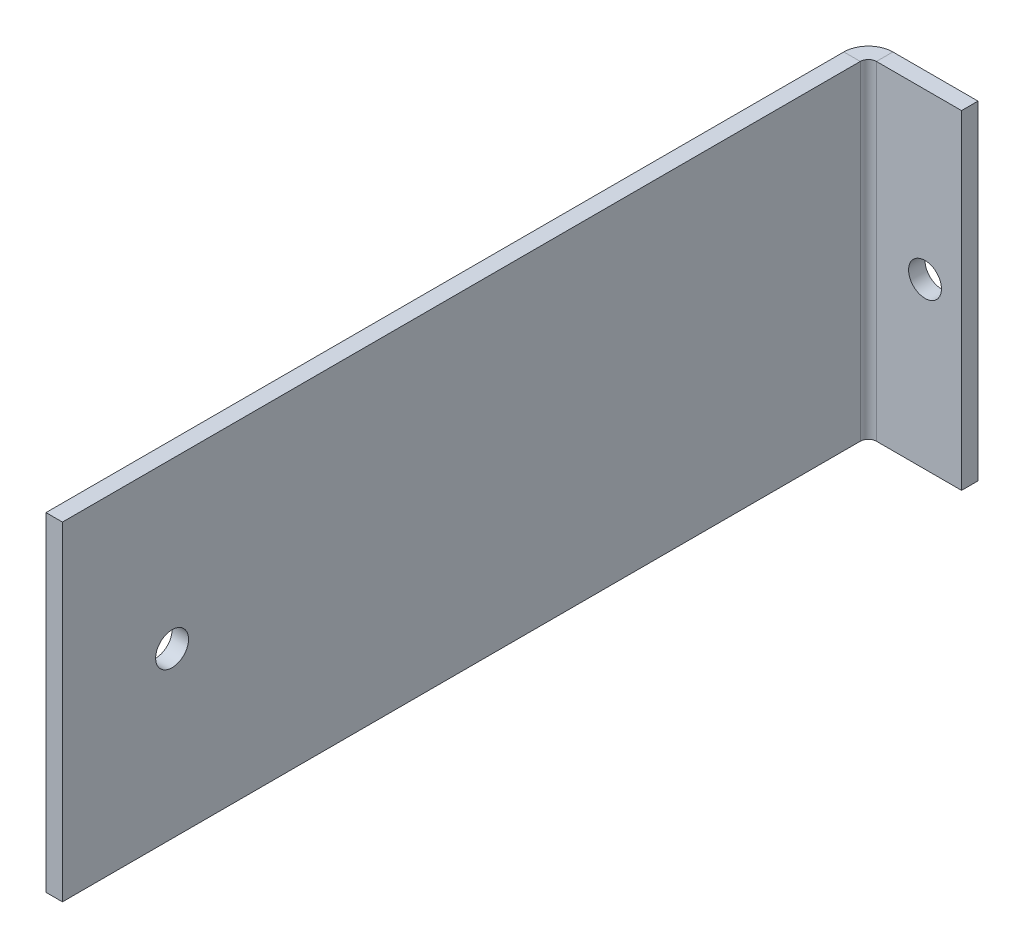
ISO-10303-21;
HEADER;
FILE_DESCRIPTION(('STEP AP214'),'2;1');
FILE_NAME('part.step','',(''),(''),'','','');
FILE_SCHEMA(('AUTOMOTIVE_DESIGN { 1 0 10303 214 1 1 1 1 }'));
ENDSEC;
DATA;
#1=APPLICATION_CONTEXT('core data for automotive mechanical design processes');
#2=APPLICATION_PROTOCOL_DEFINITION('international standard','automotive_design',2000,#1);
#3=PRODUCT_CONTEXT('',#1,'mechanical');
#4=PRODUCT('Part','Part','',(#3));
#5=PRODUCT_RELATED_PRODUCT_CATEGORY('part','',(#4));
#6=PRODUCT_DEFINITION_FORMATION('','',#4);
#7=PRODUCT_DEFINITION_CONTEXT('part definition',#1,'design');
#8=PRODUCT_DEFINITION('design','',#6,#7);
#9=PRODUCT_DEFINITION_SHAPE('','',#8);
#10=(LENGTH_UNIT() NAMED_UNIT(*) SI_UNIT(.MILLI.,.METRE.));
#11=(NAMED_UNIT(*) PLANE_ANGLE_UNIT() SI_UNIT($,.RADIAN.));
#12=(NAMED_UNIT(*) SI_UNIT($,.STERADIAN.) SOLID_ANGLE_UNIT());
#13=UNCERTAINTY_MEASURE_WITH_UNIT(LENGTH_MEASURE(1.E-05),#10,'distance_accuracy_value','');
#14=(GEOMETRIC_REPRESENTATION_CONTEXT(3) GLOBAL_UNCERTAINTY_ASSIGNED_CONTEXT((#13)) GLOBAL_UNIT_ASSIGNED_CONTEXT((#10,
#11,#12)) REPRESENTATION_CONTEXT('',''));
#15=CARTESIAN_POINT('',(0.,0.,0.));
#16=DIRECTION('',(0.,0.,1.));
#17=DIRECTION('',(1.,0.,0.));
#18=AXIS2_PLACEMENT_3D('',#15,#16,#17);
#19=CARTESIAN_POINT('',(2.2366,30.,-75.));
#20=DIRECTION('',(0.,1.,0.));
#21=DIRECTION('',(0.,0.,1.));
#22=AXIS2_PLACEMENT_3D('',#19,#20,#21);
#23=PLANE('',#22);
#24=DIRECTION('',(0.,0.,1.));
#25=VECTOR('',#24,1.);
#26=CARTESIAN_POINT('',(2.2366,30.,-75.));
#27=LINE('',#26,#25);
#28=CARTESIAN_POINT('',(2.2366,30.,-75.));
#29=VERTEX_POINT('',#28);
#30=CARTESIAN_POINT('',(2.2366,30.,-73.5));
#31=VERTEX_POINT('',#30);
#32=EDGE_CURVE('E11',#29,#31,#27,.T.);
#33=ORIENTED_EDGE('',*,*,#32,.F.);
#34=CARTESIAN_POINT('',(2.2366,30.,-72.7634));
#35=DIRECTION('',(0.,1.,0.));
#36=DIRECTION('',(0.,0.,1.));
#37=AXIS2_PLACEMENT_3D('',#34,#35,#36);
#38=CIRCLE('',#37,2.2366);
#39=CARTESIAN_POINT('',(0.,30.,-72.7634));
#40=VERTEX_POINT('',#39);
#41=EDGE_CURVE('E134',#40,#29,#38,.F.);
#42=ORIENTED_EDGE('',*,*,#41,.F.);
#43=DIRECTION('',(-1.,0.,0.));
#44=VECTOR('',#43,1.);
#45=CARTESIAN_POINT('',(1.5,30.,-72.7634));
#46=LINE('',#45,#44);
#47=CARTESIAN_POINT('',(1.5,30.,-72.7634));
#48=VERTEX_POINT('',#47);
#49=EDGE_CURVE('E45',#48,#40,#46,.T.);
#50=ORIENTED_EDGE('',*,*,#49,.F.);
#51=CARTESIAN_POINT('',(2.2366,30.,-72.7634));
#52=DIRECTION('',(0.,1.,0.));
#53=DIRECTION('',(1.,0.,0.));
#54=AXIS2_PLACEMENT_3D('',#51,#52,#53);
#55=CIRCLE('',#54,0.7366);
#56=EDGE_CURVE('E127',#48,#31,#55,.F.);
#57=ORIENTED_EDGE('',*,*,#56,.T.);
#58=EDGE_LOOP('',(#33,#42,#50,#57));
#59=FACE_BOUND('',#58,.T.);
#60=ADVANCED_FACE('F37',(#59),#23,.T.);
#61=CARTESIAN_POINT('',(1.5,30.,-72.7634));
#62=DIRECTION('',(0.,1.,0.));
#63=DIRECTION('',(0.,0.,1.));
#64=AXIS2_PLACEMENT_3D('',#61,#62,#63);
#65=PLANE('',#64);
#66=DIRECTION('',(1.,0.,0.));
#67=VECTOR('',#66,1.);
#68=CARTESIAN_POINT('',(0.,30.,-75.));
#69=LINE('',#68,#67);
#70=CARTESIAN_POINT('',(10.,30.,-75.));
#71=VERTEX_POINT('',#70);
#72=EDGE_CURVE('E184',#29,#71,#69,.T.);
#73=ORIENTED_EDGE('',*,*,#72,.F.);
#74=ORIENTED_EDGE('',*,*,#32,.T.);
#75=DIRECTION('',(1.,0.,0.));
#76=VECTOR('',#75,1.);
#77=CARTESIAN_POINT('',(0.,30.,-73.5));
#78=LINE('',#77,#76);
#79=CARTESIAN_POINT('',(10.,30.,-73.5));
#80=VERTEX_POINT('',#79);
#81=EDGE_CURVE('E93',#31,#80,#78,.T.);
#82=ORIENTED_EDGE('',*,*,#81,.T.);
#83=DIRECTION('',(0.,0.,1.));
#84=VECTOR('',#83,1.);
#85=CARTESIAN_POINT('',(10.,30.,-75.));
#86=LINE('',#85,#84);
#87=EDGE_CURVE('E359',#71,#80,#86,.T.);
#88=ORIENTED_EDGE('',*,*,#87,.F.);
#89=EDGE_LOOP('',(#73,#74,#82,#88));
#90=FACE_BOUND('',#89,.T.);
#91=ADVANCED_FACE('F192',(#90),#65,.T.);
#92=CARTESIAN_POINT('',(0.,0.,-72.7634));
#93=DIRECTION('',(0.,-1.,0.));
#94=DIRECTION('',(0.,0.,-1.));
#95=AXIS2_PLACEMENT_3D('',#92,#93,#94);
#96=PLANE('',#95);
#97=DIRECTION('',(1.,0.,0.));
#98=VECTOR('',#97,1.);
#99=CARTESIAN_POINT('',(0.,0.,-72.7634));
#100=LINE('',#99,#98);
#101=CARTESIAN_POINT('',(0.,0.,-72.7634));
#102=VERTEX_POINT('',#101);
#103=CARTESIAN_POINT('',(1.5,0.,-72.7634));
#104=VERTEX_POINT('',#103);
#105=EDGE_CURVE('E80',#102,#104,#100,.T.);
#106=ORIENTED_EDGE('',*,*,#105,.F.);
#107=CARTESIAN_POINT('',(2.2366,0.,-72.7634));
#108=DIRECTION('',(0.,1.,0.));
#109=DIRECTION('',(0.,0.,1.));
#110=AXIS2_PLACEMENT_3D('',#107,#108,#109);
#111=CIRCLE('',#110,2.2366);
#112=CARTESIAN_POINT('',(2.2366,0.,-75.));
#113=VERTEX_POINT('',#112);
#114=EDGE_CURVE('E150',#102,#113,#111,.F.);
#115=ORIENTED_EDGE('',*,*,#114,.T.);
#116=DIRECTION('',(0.,0.,-1.));
#117=VECTOR('',#116,1.);
#118=CARTESIAN_POINT('',(2.2366,0.,-73.5));
#119=LINE('',#118,#117);
#120=CARTESIAN_POINT('',(2.2366,0.,-73.5));
#121=VERTEX_POINT('',#120);
#122=EDGE_CURVE('E87',#121,#113,#119,.T.);
#123=ORIENTED_EDGE('',*,*,#122,.F.);
#124=CARTESIAN_POINT('',(2.2366,0.,-72.7634));
#125=DIRECTION('',(0.,1.,0.));
#126=DIRECTION('',(1.,0.,0.));
#127=AXIS2_PLACEMENT_3D('',#124,#125,#126);
#128=CIRCLE('',#127,0.7366);
#129=EDGE_CURVE('E157',#104,#121,#128,.F.);
#130=ORIENTED_EDGE('',*,*,#129,.F.);
#131=EDGE_LOOP('',(#106,#115,#123,#130));
#132=FACE_BOUND('',#131,.T.);
#133=ADVANCED_FACE('F190',(#132),#96,.T.);
#134=CARTESIAN_POINT('',(2.2366,0.,-73.5));
#135=DIRECTION('',(0.,-1.,0.));
#136=DIRECTION('',(0.,0.,-1.));
#137=AXIS2_PLACEMENT_3D('',#134,#135,#136);
#138=PLANE('',#137);
#139=DIRECTION('',(0.,0.,-1.));
#140=VECTOR('',#139,1.);
#141=CARTESIAN_POINT('',(0.,0.,0.));
#142=LINE('',#141,#140);
#143=CARTESIAN_POINT('',(0.,0.,0.));
#144=VERTEX_POINT('',#143);
#145=EDGE_CURVE('E152',#144,#102,#142,.T.);
#146=ORIENTED_EDGE('',*,*,#145,.T.);
#147=ORIENTED_EDGE('',*,*,#105,.T.);
#148=DIRECTION('',(0.,0.,-1.));
#149=VECTOR('',#148,1.);
#150=CARTESIAN_POINT('',(1.5,0.,0.));
#151=LINE('',#150,#149);
#152=CARTESIAN_POINT('',(1.5,0.,0.));
#153=VERTEX_POINT('',#152);
#154=EDGE_CURVE('E155',#153,#104,#151,.T.);
#155=ORIENTED_EDGE('',*,*,#154,.F.);
#156=DIRECTION('',(-1.,0.,0.));
#157=VECTOR('',#156,1.);
#158=CARTESIAN_POINT('',(1.5,0.,0.));
#159=LINE('',#158,#157);
#160=EDGE_CURVE('E115',#153,#144,#159,.T.);
#161=ORIENTED_EDGE('',*,*,#160,.T.);
#162=EDGE_LOOP('',(#146,#147,#155,#161));
#163=FACE_BOUND('',#162,.T.);
#164=ADVANCED_FACE('F186',(#163),#138,.T.);
#165=CARTESIAN_POINT('',(0.,30.,-73.5));
#166=DIRECTION('',(0.,0.,-1.));
#167=DIRECTION('',(-1.,0.,0.));
#168=AXIS2_PLACEMENT_3D('',#165,#166,#167);
#169=PLANE('',#168);
#170=CARTESIAN_POINT('',(6.66718668708199,15.,-73.5));
#171=DIRECTION('',(0.,0.,-1.));
#172=DIRECTION('',(-1.,0.,0.));
#173=AXIS2_PLACEMENT_3D('',#170,#171,#172);
#174=CIRCLE('',#173,1.49999999999999);
#175=CARTESIAN_POINT('',(5.167186687082,15.,-73.5));
#176=VERTEX_POINT('',#175);
#177=EDGE_CURVE('E144',#176,#176,#174,.T.);
#178=ORIENTED_EDGE('',*,*,#177,.T.);
#179=EDGE_LOOP('',(#178));
#180=FACE_BOUND('',#179,.T.);
#181=DIRECTION('',(1.,0.,0.));
#182=VECTOR('',#181,1.);
#183=CARTESIAN_POINT('',(0.,0.,-73.5));
#184=LINE('',#183,#182);
#185=CARTESIAN_POINT('',(10.,0.,-73.5));
#186=VERTEX_POINT('',#185);
#187=EDGE_CURVE('E140',#121,#186,#184,.T.);
#188=ORIENTED_EDGE('',*,*,#187,.T.);
#189=DIRECTION('',(0.,-1.,0.));
#190=VECTOR('',#189,1.);
#191=CARTESIAN_POINT('',(10.,30.,-73.5));
#192=LINE('',#191,#190);
#193=EDGE_CURVE('E171',#80,#186,#192,.T.);
#194=ORIENTED_EDGE('',*,*,#193,.F.);
#195=ORIENTED_EDGE('',*,*,#81,.F.);
#196=DIRECTION('',(0.,-1.,0.));
#197=VECTOR('',#196,1.);
#198=CARTESIAN_POINT('',(2.2366,30.,-73.5));
#199=LINE('',#198,#197);
#200=EDGE_CURVE('E139',#31,#121,#199,.T.);
#201=ORIENTED_EDGE('',*,*,#200,.T.);
#202=EDGE_LOOP('',(#188,#194,#195,#201));
#203=FACE_BOUND('',#202,.T.);
#204=ADVANCED_FACE('F198',(#180,#203),#169,.F.);
#205=CARTESIAN_POINT('',(10.,30.,-75.));
#206=DIRECTION('',(1.,0.,0.));
#207=DIRECTION('',(0.,0.,-1.));
#208=AXIS2_PLACEMENT_3D('',#205,#206,#207);
#209=PLANE('',#208);
#210=DIRECTION('',(0.,0.,1.));
#211=VECTOR('',#210,1.);
#212=CARTESIAN_POINT('',(10.,0.,-75.));
#213=LINE('',#212,#211);
#214=CARTESIAN_POINT('',(10.,0.,-75.));
#215=VERTEX_POINT('',#214);
#216=EDGE_CURVE('E143',#215,#186,#213,.T.);
#217=ORIENTED_EDGE('',*,*,#216,.F.);
#218=DIRECTION('',(0.,-1.,0.));
#219=VECTOR('',#218,1.);
#220=CARTESIAN_POINT('',(10.,30.,-75.));
#221=LINE('',#220,#219);
#222=EDGE_CURVE('E169',#71,#215,#221,.T.);
#223=ORIENTED_EDGE('',*,*,#222,.F.);
#224=ORIENTED_EDGE('',*,*,#87,.T.);
#225=ORIENTED_EDGE('',*,*,#193,.T.);
#226=EDGE_LOOP('',(#217,#223,#224,#225));
#227=FACE_BOUND('',#226,.T.);
#228=ADVANCED_FACE('F227',(#227),#209,.T.);
#229=CARTESIAN_POINT('',(0.,30.,-75.));
#230=DIRECTION('',(0.,0.,-1.));
#231=DIRECTION('',(-1.,0.,0.));
#232=AXIS2_PLACEMENT_3D('',#229,#230,#231);
#233=PLANE('',#232);
#234=CARTESIAN_POINT('',(6.66718668708199,15.,-75.));
#235=DIRECTION('',(0.,0.,-1.));
#236=DIRECTION('',(-1.,0.,0.));
#237=AXIS2_PLACEMENT_3D('',#234,#235,#236);
#238=CIRCLE('',#237,1.49999999999999);
#239=CARTESIAN_POINT('',(5.16718668708201,15.,-75.));
#240=VERTEX_POINT('',#239);
#241=EDGE_CURVE('E351',#240,#240,#238,.T.);
#242=ORIENTED_EDGE('',*,*,#241,.F.);
#243=EDGE_LOOP('',(#242));
#244=FACE_BOUND('',#243,.T.);
#245=DIRECTION('',(1.,0.,0.));
#246=VECTOR('',#245,1.);
#247=CARTESIAN_POINT('',(0.,0.,-75.));
#248=LINE('',#247,#246);
#249=EDGE_CURVE('E147',#113,#215,#248,.T.);
#250=ORIENTED_EDGE('',*,*,#249,.F.);
#251=DIRECTION('',(0.,-1.,0.));
#252=VECTOR('',#251,1.);
#253=CARTESIAN_POINT('',(2.2366,30.,-75.));
#254=LINE('',#253,#252);
#255=EDGE_CURVE('E166',#29,#113,#254,.T.);
#256=ORIENTED_EDGE('',*,*,#255,.F.);
#257=ORIENTED_EDGE('',*,*,#72,.T.);
#258=ORIENTED_EDGE('',*,*,#222,.T.);
#259=EDGE_LOOP('',(#250,#256,#257,#258));
#260=FACE_BOUND('',#259,.T.);
#261=ADVANCED_FACE('F232',(#244,#260),#233,.T.);
#262=CARTESIAN_POINT('',(2.2366,30.,-72.7634));
#263=DIRECTION('',(0.,-1.,0.));
#264=DIRECTION('',(0.,0.,-1.));
#265=AXIS2_PLACEMENT_3D('',#262,#263,#264);
#266=CYLINDRICAL_SURFACE('',#265,2.2366);
#267=ORIENTED_EDGE('',*,*,#114,.F.);
#268=DIRECTION('',(0.,-1.,0.));
#269=VECTOR('',#268,1.);
#270=CARTESIAN_POINT('',(0.,30.,-72.7634));
#271=LINE('',#270,#269);
#272=EDGE_CURVE('E163',#40,#102,#271,.T.);
#273=ORIENTED_EDGE('',*,*,#272,.F.);
#274=ORIENTED_EDGE('',*,*,#41,.T.);
#275=ORIENTED_EDGE('',*,*,#255,.T.);
#276=EDGE_LOOP('',(#267,#273,#274,#275));
#277=FACE_BOUND('',#276,.T.);
#278=ADVANCED_FACE('F180',(#277),#266,.T.);
#279=CARTESIAN_POINT('',(0.,30.,0.));
#280=DIRECTION('',(-1.,0.,0.));
#281=DIRECTION('',(0.,0.,1.));
#282=AXIS2_PLACEMENT_3D('',#279,#280,#281);
#283=PLANE('',#282);
#284=CARTESIAN_POINT('',(0.,15.,-10.));
#285=DIRECTION('',(-1.,0.,0.));
#286=DIRECTION('',(0.,0.,1.));
#287=AXIS2_PLACEMENT_3D('',#284,#285,#286);
#288=CIRCLE('',#287,1.49999999999999);
#289=CARTESIAN_POINT('',(0.,15.,-8.50000000000001));
#290=VERTEX_POINT('',#289);
#291=EDGE_CURVE('E349',#290,#290,#288,.T.);
#292=ORIENTED_EDGE('',*,*,#291,.F.);
#293=EDGE_LOOP('',(#292));
#294=FACE_BOUND('',#293,.T.);
#295=ORIENTED_EDGE('',*,*,#145,.F.);
#296=DIRECTION('',(0.,-1.,0.));
#297=VECTOR('',#296,1.);
#298=CARTESIAN_POINT('',(0.,30.,0.));
#299=LINE('',#298,#297);
#300=CARTESIAN_POINT('',(0.,30.,0.));
#301=VERTEX_POINT('',#300);
#302=EDGE_CURVE('E117',#301,#144,#299,.T.);
#303=ORIENTED_EDGE('',*,*,#302,.F.);
#304=DIRECTION('',(0.,0.,-1.));
#305=VECTOR('',#304,1.);
#306=CARTESIAN_POINT('',(0.,30.,0.));
#307=LINE('',#306,#305);
#308=EDGE_CURVE('E132',#301,#40,#307,.T.);
#309=ORIENTED_EDGE('',*,*,#308,.T.);
#310=ORIENTED_EDGE('',*,*,#272,.T.);
#311=EDGE_LOOP('',(#295,#303,#309,#310));
#312=FACE_BOUND('',#311,.T.);
#313=ADVANCED_FACE('F185',(#294,#312),#283,.T.);
#314=CARTESIAN_POINT('',(1.5,30.,0.));
#315=DIRECTION('',(0.,0.,1.));
#316=DIRECTION('',(1.,0.,0.));
#317=AXIS2_PLACEMENT_3D('',#314,#315,#316);
#318=PLANE('',#317);
#319=ORIENTED_EDGE('',*,*,#160,.F.);
#320=DIRECTION('',(0.,-1.,0.));
#321=VECTOR('',#320,1.);
#322=CARTESIAN_POINT('',(1.5,30.,0.));
#323=LINE('',#322,#321);
#324=CARTESIAN_POINT('',(1.5,30.,0.));
#325=VERTEX_POINT('',#324);
#326=EDGE_CURVE('E109',#325,#153,#323,.T.);
#327=ORIENTED_EDGE('',*,*,#326,.F.);
#328=DIRECTION('',(-1.,0.,0.));
#329=VECTOR('',#328,1.);
#330=CARTESIAN_POINT('',(1.5,30.,0.));
#331=LINE('',#330,#329);
#332=EDGE_CURVE('E113',#325,#301,#331,.T.);
#333=ORIENTED_EDGE('',*,*,#332,.T.);
#334=ORIENTED_EDGE('',*,*,#302,.T.);
#335=EDGE_LOOP('',(#319,#327,#333,#334));
#336=FACE_BOUND('',#335,.T.);
#337=ADVANCED_FACE('F111',(#336),#318,.T.);
#338=CARTESIAN_POINT('',(1.5,30.,0.));
#339=DIRECTION('',(-1.,0.,0.));
#340=DIRECTION('',(0.,0.,1.));
#341=AXIS2_PLACEMENT_3D('',#338,#339,#340);
#342=PLANE('',#341);
#343=CARTESIAN_POINT('',(1.5,15.,-10.));
#344=DIRECTION('',(-1.,0.,0.));
#345=DIRECTION('',(0.,0.,1.));
#346=AXIS2_PLACEMENT_3D('',#343,#344,#345);
#347=CIRCLE('',#346,1.49999999999999);
#348=CARTESIAN_POINT('',(1.5,15.,-8.5));
#349=VERTEX_POINT('',#348);
#350=EDGE_CURVE('E346',#349,#349,#347,.T.);
#351=ORIENTED_EDGE('',*,*,#350,.T.);
#352=EDGE_LOOP('',(#351));
#353=FACE_BOUND('',#352,.T.);
#354=ORIENTED_EDGE('',*,*,#154,.T.);
#355=DIRECTION('',(0.,-1.,0.));
#356=VECTOR('',#355,1.);
#357=CARTESIAN_POINT('',(1.5,30.,-72.7634));
#358=LINE('',#357,#356);
#359=EDGE_CURVE('E118',#48,#104,#358,.T.);
#360=ORIENTED_EDGE('',*,*,#359,.F.);
#361=DIRECTION('',(0.,0.,-1.));
#362=VECTOR('',#361,1.);
#363=CARTESIAN_POINT('',(1.5,30.,0.));
#364=LINE('',#363,#362);
#365=EDGE_CURVE('E122',#325,#48,#364,.T.);
#366=ORIENTED_EDGE('',*,*,#365,.F.);
#367=ORIENTED_EDGE('',*,*,#326,.T.);
#368=EDGE_LOOP('',(#354,#360,#366,#367));
#369=FACE_BOUND('',#368,.T.);
#370=ADVANCED_FACE('F123',(#353,#369),#342,.F.);
#371=CARTESIAN_POINT('',(2.2366,30.,-72.7634));
#372=DIRECTION('',(0.,-1.,0.));
#373=DIRECTION('',(0.,0.,-1.));
#374=AXIS2_PLACEMENT_3D('',#371,#372,#373);
#375=CYLINDRICAL_SURFACE('',#374,0.7366);
#376=ORIENTED_EDGE('',*,*,#129,.T.);
#377=ORIENTED_EDGE('',*,*,#200,.F.);
#378=ORIENTED_EDGE('',*,*,#56,.F.);
#379=ORIENTED_EDGE('',*,*,#359,.T.);
#380=EDGE_LOOP('',(#376,#377,#378,#379));
#381=FACE_BOUND('',#380,.T.);
#382=ADVANCED_FACE('F188',(#381),#375,.F.);
#383=CARTESIAN_POINT('',(2.2366,30.,-72.7634));
#384=DIRECTION('',(0.,1.,0.));
#385=DIRECTION('',(1.,0.,0.));
#386=AXIS2_PLACEMENT_3D('',#383,#384,#385);
#387=PLANE('',#386);
#388=ORIENTED_EDGE('',*,*,#365,.T.);
#389=ORIENTED_EDGE('',*,*,#49,.T.);
#390=ORIENTED_EDGE('',*,*,#308,.F.);
#391=ORIENTED_EDGE('',*,*,#332,.F.);
#392=EDGE_LOOP('',(#388,#389,#390,#391));
#393=FACE_BOUND('',#392,.T.);
#394=ADVANCED_FACE('F130',(#393),#387,.T.);
#395=CARTESIAN_POINT('',(2.2366,0.,-72.7634));
#396=DIRECTION('',(0.,1.,0.));
#397=DIRECTION('',(1.,0.,0.));
#398=AXIS2_PLACEMENT_3D('',#395,#396,#397);
#399=PLANE('',#398);
#400=ORIENTED_EDGE('',*,*,#187,.F.);
#401=ORIENTED_EDGE('',*,*,#122,.T.);
#402=ORIENTED_EDGE('',*,*,#249,.T.);
#403=ORIENTED_EDGE('',*,*,#216,.T.);
#404=EDGE_LOOP('',(#400,#401,#402,#403));
#405=FACE_BOUND('',#404,.T.);
#406=ADVANCED_FACE('F276',(#405),#399,.F.);
#407=CARTESIAN_POINT('',(6.66718668708199,15.,-75.));
#408=DIRECTION('',(0.,0.,-1.));
#409=DIRECTION('',(-1.,0.,0.));
#410=AXIS2_PLACEMENT_3D('',#407,#408,#409);
#411=CYLINDRICAL_SURFACE('',#410,1.49999999999999);
#412=ORIENTED_EDGE('',*,*,#177,.F.);
#413=EDGE_LOOP('',(#412));
#414=FACE_BOUND('',#413,.T.);
#415=ORIENTED_EDGE('',*,*,#241,.T.);
#416=EDGE_LOOP('',(#415));
#417=FACE_BOUND('',#416,.T.);
#418=ADVANCED_FACE('F286',(#414,#417),#411,.F.);
#419=CARTESIAN_POINT('',(0.,15.,-10.));
#420=DIRECTION('',(-1.,0.,0.));
#421=DIRECTION('',(0.,0.,1.));
#422=AXIS2_PLACEMENT_3D('',#419,#420,#421);
#423=CYLINDRICAL_SURFACE('',#422,1.49999999999999);
#424=ORIENTED_EDGE('',*,*,#350,.F.);
#425=EDGE_LOOP('',(#424));
#426=FACE_BOUND('',#425,.T.);
#427=ORIENTED_EDGE('',*,*,#291,.T.);
#428=EDGE_LOOP('',(#427));
#429=FACE_BOUND('',#428,.T.);
#430=ADVANCED_FACE('F313',(#426,#429),#423,.F.);
#431=CLOSED_SHELL('',(#60,#91,#133,#164,#204,#228,#261,#278,#313,#337,#370,#382,#394,#406,#418,#430));
#432=MANIFOLD_SOLID_BREP('B2',#431);
#433=ADVANCED_BREP_SHAPE_REPRESENTATION('',(#18,#432),#14);
#434=SHAPE_DEFINITION_REPRESENTATION(#9,#433);
ENDSEC;
END-ISO-10303-21;
